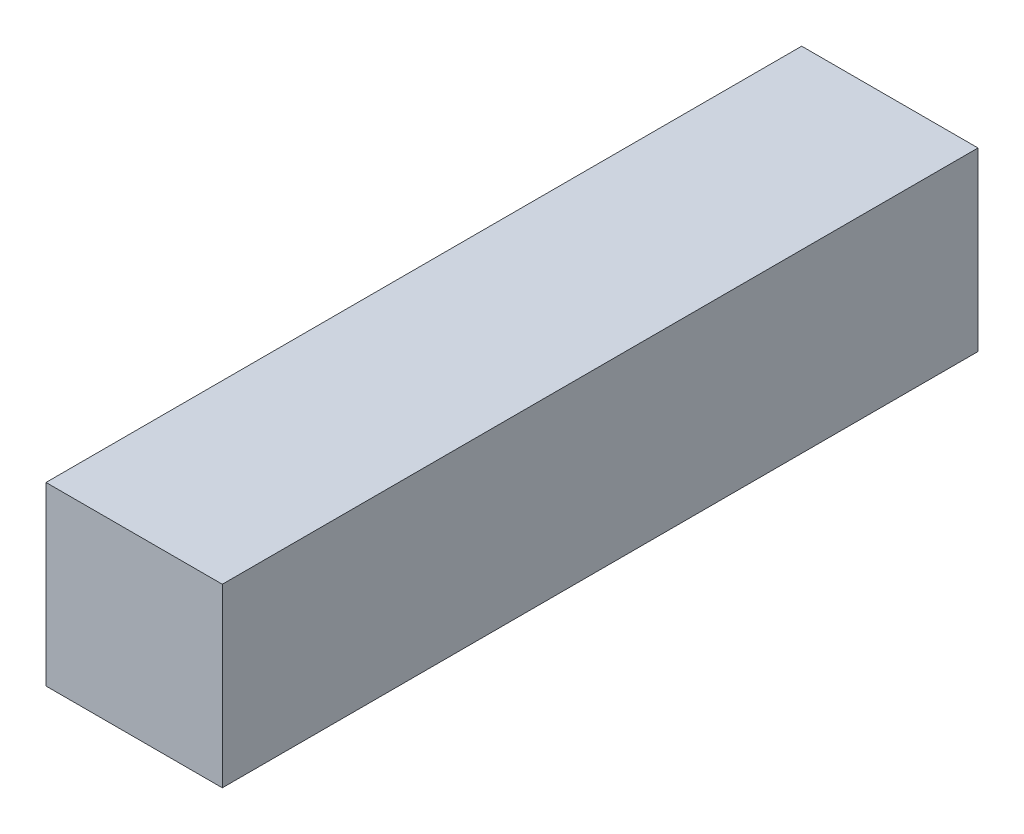
ISO-10303-21;
HEADER;
FILE_DESCRIPTION(('STEP AP214'),'2;1');
FILE_NAME('part.step','',(''),(''),'','','');
FILE_SCHEMA(('AUTOMOTIVE_DESIGN { 1 0 10303 214 1 1 1 1 }'));
ENDSEC;
DATA;
#1=APPLICATION_CONTEXT('core data for automotive mechanical design processes');
#2=APPLICATION_PROTOCOL_DEFINITION('international standard','automotive_design',2000,#1);
#3=PRODUCT_CONTEXT('',#1,'mechanical');
#4=PRODUCT('Part','Part','',(#3));
#5=PRODUCT_RELATED_PRODUCT_CATEGORY('part','',(#4));
#6=PRODUCT_DEFINITION_FORMATION('','',#4);
#7=PRODUCT_DEFINITION_CONTEXT('part definition',#1,'design');
#8=PRODUCT_DEFINITION('design','',#6,#7);
#9=PRODUCT_DEFINITION_SHAPE('','',#8);
#10=(LENGTH_UNIT() NAMED_UNIT(*) SI_UNIT(.MILLI.,.METRE.));
#11=(NAMED_UNIT(*) PLANE_ANGLE_UNIT() SI_UNIT($,.RADIAN.));
#12=(NAMED_UNIT(*) SI_UNIT($,.STERADIAN.) SOLID_ANGLE_UNIT());
#13=UNCERTAINTY_MEASURE_WITH_UNIT(LENGTH_MEASURE(1.E-05),#10,'distance_accuracy_value','');
#14=(GEOMETRIC_REPRESENTATION_CONTEXT(3) GLOBAL_UNCERTAINTY_ASSIGNED_CONTEXT((#13)) GLOBAL_UNIT_ASSIGNED_CONTEXT((#10,
#11,#12)) REPRESENTATION_CONTEXT('',''));
#15=CARTESIAN_POINT('',(0.,0.,0.));
#16=DIRECTION('',(0.,0.,1.));
#17=DIRECTION('',(1.,0.,0.));
#18=AXIS2_PLACEMENT_3D('',#15,#16,#17);
#19=CARTESIAN_POINT('',(0.,0.,12.));
#20=DIRECTION('',(1.,0.,0.));
#21=DIRECTION('',(0.,1.,0.));
#22=AXIS2_PLACEMENT_3D('',#19,#20,#21);
#23=PLANE('',#22);
#24=DIRECTION('',(0.,-1.,0.));
#25=VECTOR('',#24,1.);
#26=CARTESIAN_POINT('',(0.,0.,0.));
#27=LINE('',#26,#25);
#28=CARTESIAN_POINT('',(0.,2.8,0.));
#29=VERTEX_POINT('',#28);
#30=CARTESIAN_POINT('',(0.,0.,0.));
#31=VERTEX_POINT('',#30);
#32=EDGE_CURVE('E102',#29,#31,#27,.T.);
#33=ORIENTED_EDGE('',*,*,#32,.T.);
#34=DIRECTION('',(0.,0.,-1.));
#35=VECTOR('',#34,1.);
#36=CARTESIAN_POINT('',(0.,0.,12.));
#37=LINE('',#36,#35);
#38=CARTESIAN_POINT('',(0.,0.,12.));
#39=VERTEX_POINT('',#38);
#40=EDGE_CURVE('E11',#39,#31,#37,.T.);
#41=ORIENTED_EDGE('',*,*,#40,.F.);
#42=DIRECTION('',(0.,-1.,0.));
#43=VECTOR('',#42,1.);
#44=CARTESIAN_POINT('',(0.,0.,12.));
#45=LINE('',#44,#43);
#46=CARTESIAN_POINT('',(0.,2.8,12.));
#47=VERTEX_POINT('',#46);
#48=EDGE_CURVE('E90',#47,#39,#45,.T.);
#49=ORIENTED_EDGE('',*,*,#48,.F.);
#50=DIRECTION('',(0.,0.,-1.));
#51=VECTOR('',#50,1.);
#52=CARTESIAN_POINT('',(0.,2.8,12.));
#53=LINE('',#52,#51);
#54=EDGE_CURVE('E98',#47,#29,#53,.T.);
#55=ORIENTED_EDGE('',*,*,#54,.T.);
#56=EDGE_LOOP('',(#33,#41,#49,#55));
#57=FACE_BOUND('',#56,.T.);
#58=ADVANCED_FACE('F39',(#57),#23,.F.);
#59=CARTESIAN_POINT('',(0.,0.,12.));
#60=DIRECTION('',(0.,1.,0.));
#61=DIRECTION('',(0.,0.,1.));
#62=AXIS2_PLACEMENT_3D('',#59,#60,#61);
#63=PLANE('',#62);
#64=DIRECTION('',(1.,0.,0.));
#65=VECTOR('',#64,1.);
#66=CARTESIAN_POINT('',(0.,0.,0.));
#67=LINE('',#66,#65);
#68=CARTESIAN_POINT('',(2.8,0.,0.));
#69=VERTEX_POINT('',#68);
#70=EDGE_CURVE('E94',#31,#69,#67,.T.);
#71=ORIENTED_EDGE('',*,*,#70,.T.);
#72=DIRECTION('',(0.,0.,-1.));
#73=VECTOR('',#72,1.);
#74=CARTESIAN_POINT('',(2.8,0.,12.));
#75=LINE('',#74,#73);
#76=CARTESIAN_POINT('',(2.8,0.,12.));
#77=VERTEX_POINT('',#76);
#78=EDGE_CURVE('E47',#77,#69,#75,.T.);
#79=ORIENTED_EDGE('',*,*,#78,.F.);
#80=DIRECTION('',(1.,0.,0.));
#81=VECTOR('',#80,1.);
#82=CARTESIAN_POINT('',(0.,0.,12.));
#83=LINE('',#82,#81);
#84=EDGE_CURVE('E85',#39,#77,#83,.T.);
#85=ORIENTED_EDGE('',*,*,#84,.F.);
#86=ORIENTED_EDGE('',*,*,#40,.T.);
#87=EDGE_LOOP('',(#71,#79,#85,#86));
#88=FACE_BOUND('',#87,.T.);
#89=ADVANCED_FACE('F93',(#88),#63,.F.);
#90=CARTESIAN_POINT('',(2.8,0.,12.));
#91=DIRECTION('',(-1.,0.,0.));
#92=DIRECTION('',(0.,-1.,0.));
#93=AXIS2_PLACEMENT_3D('',#90,#91,#92);
#94=PLANE('',#93);
#95=DIRECTION('',(0.,1.,0.));
#96=VECTOR('',#95,1.);
#97=CARTESIAN_POINT('',(2.8,0.,0.));
#98=LINE('',#97,#96);
#99=CARTESIAN_POINT('',(2.8,2.8,0.));
#100=VERTEX_POINT('',#99);
#101=EDGE_CURVE('E72',#69,#100,#98,.T.);
#102=ORIENTED_EDGE('',*,*,#101,.T.);
#103=DIRECTION('',(0.,0.,-1.));
#104=VECTOR('',#103,1.);
#105=CARTESIAN_POINT('',(2.8,2.8,12.));
#106=LINE('',#105,#104);
#107=CARTESIAN_POINT('',(2.8,2.8,12.));
#108=VERTEX_POINT('',#107);
#109=EDGE_CURVE('E95',#108,#100,#106,.T.);
#110=ORIENTED_EDGE('',*,*,#109,.F.);
#111=DIRECTION('',(0.,1.,0.));
#112=VECTOR('',#111,1.);
#113=CARTESIAN_POINT('',(2.8,0.,12.));
#114=LINE('',#113,#112);
#115=EDGE_CURVE('E88',#77,#108,#114,.T.);
#116=ORIENTED_EDGE('',*,*,#115,.F.);
#117=ORIENTED_EDGE('',*,*,#78,.T.);
#118=EDGE_LOOP('',(#102,#110,#116,#117));
#119=FACE_BOUND('',#118,.T.);
#120=ADVANCED_FACE('F96',(#119),#94,.F.);
#121=CARTESIAN_POINT('',(0.,2.8,12.));
#122=DIRECTION('',(0.,-1.,0.));
#123=DIRECTION('',(0.,0.,-1.));
#124=AXIS2_PLACEMENT_3D('',#121,#122,#123);
#125=PLANE('',#124);
#126=DIRECTION('',(-1.,0.,0.));
#127=VECTOR('',#126,1.);
#128=CARTESIAN_POINT('',(0.,2.8,0.));
#129=LINE('',#128,#127);
#130=EDGE_CURVE('E78',#100,#29,#129,.T.);
#131=ORIENTED_EDGE('',*,*,#130,.T.);
#132=ORIENTED_EDGE('',*,*,#54,.F.);
#133=DIRECTION('',(-1.,0.,0.));
#134=VECTOR('',#133,1.);
#135=CARTESIAN_POINT('',(0.,2.8,12.));
#136=LINE('',#135,#134);
#137=EDGE_CURVE('E55',#108,#47,#136,.T.);
#138=ORIENTED_EDGE('',*,*,#137,.F.);
#139=ORIENTED_EDGE('',*,*,#109,.T.);
#140=EDGE_LOOP('',(#131,#132,#138,#139));
#141=FACE_BOUND('',#140,.T.);
#142=ADVANCED_FACE('F109',(#141),#125,.F.);
#143=CARTESIAN_POINT('',(0.,0.,12.));
#144=DIRECTION('',(0.,0.,-1.));
#145=DIRECTION('',(-1.,0.,0.));
#146=AXIS2_PLACEMENT_3D('',#143,#144,#145);
#147=PLANE('',#146);
#148=ORIENTED_EDGE('',*,*,#48,.T.);
#149=ORIENTED_EDGE('',*,*,#84,.T.);
#150=ORIENTED_EDGE('',*,*,#115,.T.);
#151=ORIENTED_EDGE('',*,*,#137,.T.);
#152=EDGE_LOOP('',(#148,#149,#150,#151));
#153=FACE_BOUND('',#152,.T.);
#154=ADVANCED_FACE('F86',(#153),#147,.F.);
#155=CARTESIAN_POINT('',(0.,0.,0.));
#156=DIRECTION('',(0.,0.,-1.));
#157=DIRECTION('',(-1.,0.,0.));
#158=AXIS2_PLACEMENT_3D('',#155,#156,#157);
#159=PLANE('',#158);
#160=ORIENTED_EDGE('',*,*,#32,.F.);
#161=ORIENTED_EDGE('',*,*,#130,.F.);
#162=ORIENTED_EDGE('',*,*,#101,.F.);
#163=ORIENTED_EDGE('',*,*,#70,.F.);
#164=EDGE_LOOP('',(#160,#161,#162,#163));
#165=FACE_BOUND('',#164,.T.);
#166=ADVANCED_FACE('F112',(#165),#159,.T.);
#167=CLOSED_SHELL('',(#58,#89,#120,#142,#154,#166));
#168=MANIFOLD_SOLID_BREP('B2',#167);
#169=ADVANCED_BREP_SHAPE_REPRESENTATION('',(#18,#168),#14);
#170=SHAPE_DEFINITION_REPRESENTATION(#9,#169);
ENDSEC;
END-ISO-10303-21;
